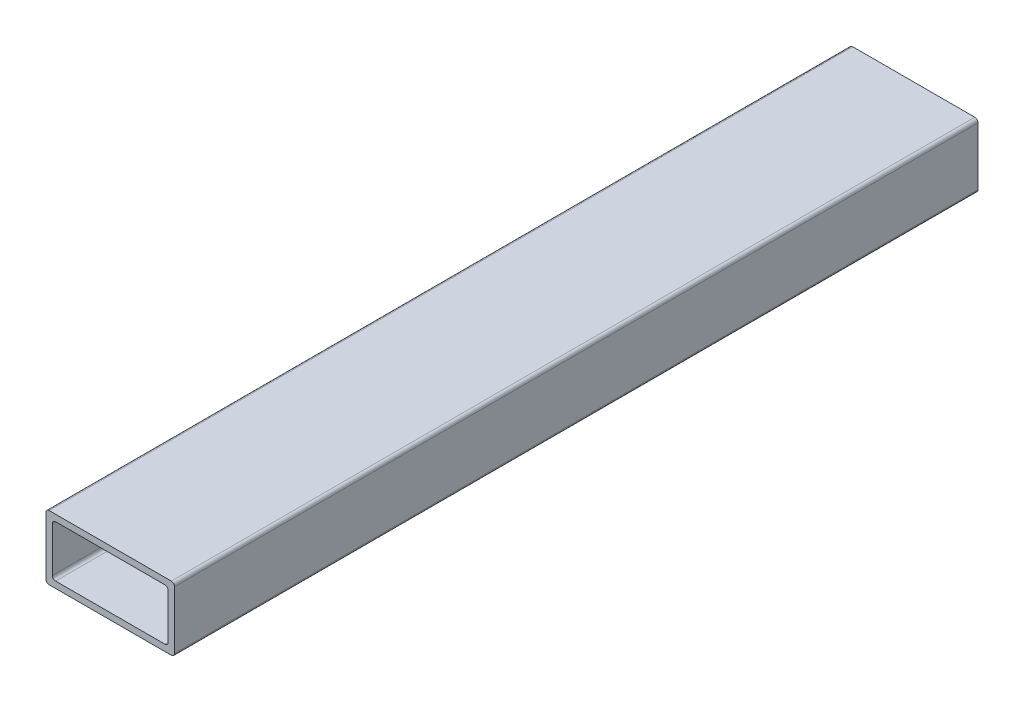
ISO-10303-21;
HEADER;
FILE_DESCRIPTION(('STEP AP214'),'2;1');
FILE_NAME('part.step','',(''),(''),'','','');
FILE_SCHEMA(('AUTOMOTIVE_DESIGN { 1 0 10303 214 1 1 1 1 }'));
ENDSEC;
DATA;
#1=APPLICATION_CONTEXT('core data for automotive mechanical design processes');
#2=APPLICATION_PROTOCOL_DEFINITION('international standard','automotive_design',2000,#1);
#3=PRODUCT_CONTEXT('',#1,'mechanical');
#4=PRODUCT('Part','Part','',(#3));
#5=PRODUCT_RELATED_PRODUCT_CATEGORY('part','',(#4));
#6=PRODUCT_DEFINITION_FORMATION('','',#4);
#7=PRODUCT_DEFINITION_CONTEXT('part definition',#1,'design');
#8=PRODUCT_DEFINITION('design','',#6,#7);
#9=PRODUCT_DEFINITION_SHAPE('','',#8);
#10=(LENGTH_UNIT() NAMED_UNIT(*) SI_UNIT(.MILLI.,.METRE.));
#11=(NAMED_UNIT(*) PLANE_ANGLE_UNIT() SI_UNIT($,.RADIAN.));
#12=(NAMED_UNIT(*) SI_UNIT($,.STERADIAN.) SOLID_ANGLE_UNIT());
#13=UNCERTAINTY_MEASURE_WITH_UNIT(LENGTH_MEASURE(1.E-05),#10,'distance_accuracy_value','');
#14=(GEOMETRIC_REPRESENTATION_CONTEXT(3) GLOBAL_UNCERTAINTY_ASSIGNED_CONTEXT((#13)) GLOBAL_UNIT_ASSIGNED_CONTEXT((#10,
#11,#12)) REPRESENTATION_CONTEXT('',''));
#15=CARTESIAN_POINT('',(0.,0.,0.));
#16=DIRECTION('',(0.,0.,1.));
#17=DIRECTION('',(1.,0.,0.));
#18=AXIS2_PLACEMENT_3D('',#15,#16,#17);
#19=CARTESIAN_POINT('',(2.,2.,500.));
#20=DIRECTION('',(0.,0.,-1.));
#21=DIRECTION('',(-1.,0.,0.));
#22=AXIS2_PLACEMENT_3D('',#19,#20,#21);
#23=PLANE('',#22);
#24=CARTESIAN_POINT('',(2.,2.,500.));
#25=DIRECTION('',(0.,0.,1.));
#26=DIRECTION('',(-1.,0.,0.));
#27=AXIS2_PLACEMENT_3D('',#24,#25,#26);
#28=CIRCLE('',#27,2.);
#29=CARTESIAN_POINT('',(0.,2.00000000000001,500.));
#30=VERTEX_POINT('',#29);
#31=CARTESIAN_POINT('',(2.00000000000001,0.,500.));
#32=VERTEX_POINT('',#31);
#33=EDGE_CURVE('E210',#30,#32,#28,.T.);
#34=ORIENTED_EDGE('',*,*,#33,.T.);
#35=DIRECTION('',(1.,0.,0.));
#36=VECTOR('',#35,1.);
#37=CARTESIAN_POINT('',(2.00000000000001,0.,500.));
#38=LINE('',#37,#36);
#39=CARTESIAN_POINT('',(78.,0.,500.));
#40=VERTEX_POINT('',#39);
#41=EDGE_CURVE('E213',#32,#40,#38,.T.);
#42=ORIENTED_EDGE('',*,*,#41,.T.);
#43=CARTESIAN_POINT('',(78.,2.,500.));
#44=DIRECTION('',(0.,0.,1.));
#45=DIRECTION('',(-1.,0.,0.));
#46=AXIS2_PLACEMENT_3D('',#43,#44,#45);
#47=CIRCLE('',#46,2.);
#48=CARTESIAN_POINT('',(80.,2.,500.));
#49=VERTEX_POINT('',#48);
#50=EDGE_CURVE('E216',#40,#49,#47,.T.);
#51=ORIENTED_EDGE('',*,*,#50,.T.);
#52=DIRECTION('',(0.,1.,0.));
#53=VECTOR('',#52,1.);
#54=CARTESIAN_POINT('',(80.,2.,500.));
#55=LINE('',#54,#53);
#56=CARTESIAN_POINT('',(80.,38.,500.));
#57=VERTEX_POINT('',#56);
#58=EDGE_CURVE('E218',#49,#57,#55,.T.);
#59=ORIENTED_EDGE('',*,*,#58,.T.);
#60=CARTESIAN_POINT('',(78.,38.,500.));
#61=DIRECTION('',(0.,0.,1.));
#62=DIRECTION('',(-1.,0.,0.));
#63=AXIS2_PLACEMENT_3D('',#60,#61,#62);
#64=CIRCLE('',#63,2.);
#65=CARTESIAN_POINT('',(78.,40.,500.));
#66=VERTEX_POINT('',#65);
#67=EDGE_CURVE('E220',#57,#66,#64,.T.);
#68=ORIENTED_EDGE('',*,*,#67,.T.);
#69=DIRECTION('',(-1.,0.,0.));
#70=VECTOR('',#69,1.);
#71=CARTESIAN_POINT('',(2.00000000000001,40.,500.));
#72=LINE('',#71,#70);
#73=CARTESIAN_POINT('',(2.00000000000001,40.,500.));
#74=VERTEX_POINT('',#73);
#75=EDGE_CURVE('E222',#66,#74,#72,.T.);
#76=ORIENTED_EDGE('',*,*,#75,.T.);
#77=CARTESIAN_POINT('',(2.,38.,500.));
#78=DIRECTION('',(0.,0.,1.));
#79=DIRECTION('',(-1.,0.,0.));
#80=AXIS2_PLACEMENT_3D('',#77,#78,#79);
#81=CIRCLE('',#80,2.);
#82=CARTESIAN_POINT('',(0.,38.,500.));
#83=VERTEX_POINT('',#82);
#84=EDGE_CURVE('E224',#74,#83,#81,.T.);
#85=ORIENTED_EDGE('',*,*,#84,.T.);
#86=DIRECTION('',(0.,-1.,0.));
#87=VECTOR('',#86,1.);
#88=CARTESIAN_POINT('',(0.,2.00000000000001,500.));
#89=LINE('',#88,#87);
#90=EDGE_CURVE('E226',#83,#30,#89,.T.);
#91=ORIENTED_EDGE('',*,*,#90,.T.);
#92=EDGE_LOOP('',(#34,#42,#51,#59,#68,#76,#85,#91));
#93=FACE_BOUND('',#92,.T.);
#94=CARTESIAN_POINT('',(74.,6.,500.));
#95=DIRECTION('',(0.,0.,1.));
#96=DIRECTION('',(1.,0.,0.));
#97=AXIS2_PLACEMENT_3D('',#94,#95,#96);
#98=CIRCLE('',#97,2.);
#99=CARTESIAN_POINT('',(74.,4.,500.));
#100=VERTEX_POINT('',#99);
#101=CARTESIAN_POINT('',(76.,6.,500.));
#102=VERTEX_POINT('',#101);
#103=EDGE_CURVE('E145',#100,#102,#98,.T.);
#104=ORIENTED_EDGE('',*,*,#103,.F.);
#105=DIRECTION('',(1.,0.,0.));
#106=VECTOR('',#105,1.);
#107=CARTESIAN_POINT('',(6.00000000000001,4.,500.));
#108=LINE('',#107,#106);
#109=CARTESIAN_POINT('',(6.00000000000001,4.,500.));
#110=VERTEX_POINT('',#109);
#111=EDGE_CURVE('E178',#110,#100,#108,.T.);
#112=ORIENTED_EDGE('',*,*,#111,.F.);
#113=CARTESIAN_POINT('',(6.,6.,500.));
#114=DIRECTION('',(0.,0.,1.));
#115=DIRECTION('',(1.,0.,0.));
#116=AXIS2_PLACEMENT_3D('',#113,#114,#115);
#117=CIRCLE('',#116,2.);
#118=CARTESIAN_POINT('',(4.,6.00000000000001,500.));
#119=VERTEX_POINT('',#118);
#120=EDGE_CURVE('E176',#119,#110,#117,.T.);
#121=ORIENTED_EDGE('',*,*,#120,.F.);
#122=DIRECTION('',(0.,-1.,0.));
#123=VECTOR('',#122,1.);
#124=CARTESIAN_POINT('',(4.,6.00000000000001,500.));
#125=LINE('',#124,#123);
#126=CARTESIAN_POINT('',(4.,34.,500.));
#127=VERTEX_POINT('',#126);
#128=EDGE_CURVE('E174',#127,#119,#125,.T.);
#129=ORIENTED_EDGE('',*,*,#128,.F.);
#130=CARTESIAN_POINT('',(6.,34.,500.));
#131=DIRECTION('',(0.,0.,1.));
#132=DIRECTION('',(1.,0.,0.));
#133=AXIS2_PLACEMENT_3D('',#130,#131,#132);
#134=CIRCLE('',#133,2.);
#135=CARTESIAN_POINT('',(6.00000000000001,36.,500.));
#136=VERTEX_POINT('',#135);
#137=EDGE_CURVE('E172',#136,#127,#134,.T.);
#138=ORIENTED_EDGE('',*,*,#137,.F.);
#139=DIRECTION('',(-1.,0.,0.));
#140=VECTOR('',#139,1.);
#141=CARTESIAN_POINT('',(6.00000000000001,36.,500.));
#142=LINE('',#141,#140);
#143=CARTESIAN_POINT('',(74.,36.,500.));
#144=VERTEX_POINT('',#143);
#145=EDGE_CURVE('E168',#144,#136,#142,.T.);
#146=ORIENTED_EDGE('',*,*,#145,.F.);
#147=CARTESIAN_POINT('',(74.,34.,500.));
#148=DIRECTION('',(0.,0.,1.));
#149=DIRECTION('',(1.,0.,0.));
#150=AXIS2_PLACEMENT_3D('',#147,#148,#149);
#151=CIRCLE('',#150,2.);
#152=CARTESIAN_POINT('',(76.,34.,500.));
#153=VERTEX_POINT('',#152);
#154=EDGE_CURVE('E166',#153,#144,#151,.T.);
#155=ORIENTED_EDGE('',*,*,#154,.F.);
#156=DIRECTION('',(0.,1.,0.));
#157=VECTOR('',#156,1.);
#158=CARTESIAN_POINT('',(76.,6.,500.));
#159=LINE('',#158,#157);
#160=EDGE_CURVE('E153',#102,#153,#159,.T.);
#161=ORIENTED_EDGE('',*,*,#160,.F.);
#162=EDGE_LOOP('',(#104,#112,#121,#129,#138,#146,#155,#161));
#163=FACE_BOUND('',#162,.T.);
#164=ADVANCED_FACE('F32',(#93,#163),#23,.F.);
#165=CARTESIAN_POINT('',(2.,2.,0.));
#166=DIRECTION('',(0.,0.,-1.));
#167=DIRECTION('',(-1.,0.,0.));
#168=AXIS2_PLACEMENT_3D('',#165,#166,#167);
#169=PLANE('',#168);
#170=CARTESIAN_POINT('',(2.,2.,0.));
#171=DIRECTION('',(0.,0.,1.));
#172=DIRECTION('',(-1.,0.,0.));
#173=AXIS2_PLACEMENT_3D('',#170,#171,#172);
#174=CIRCLE('',#173,2.);
#175=CARTESIAN_POINT('',(0.,2.00000000000001,0.));
#176=VERTEX_POINT('',#175);
#177=CARTESIAN_POINT('',(2.00000000000001,0.,0.));
#178=VERTEX_POINT('',#177);
#179=EDGE_CURVE('E161',#176,#178,#174,.T.);
#180=ORIENTED_EDGE('',*,*,#179,.F.);
#181=DIRECTION('',(0.,-1.,0.));
#182=VECTOR('',#181,1.);
#183=CARTESIAN_POINT('',(0.,2.00000000000001,0.));
#184=LINE('',#183,#182);
#185=CARTESIAN_POINT('',(0.,38.,0.));
#186=VERTEX_POINT('',#185);
#187=EDGE_CURVE('E214',#186,#176,#184,.T.);
#188=ORIENTED_EDGE('',*,*,#187,.F.);
#189=CARTESIAN_POINT('',(2.,38.,0.));
#190=DIRECTION('',(0.,0.,1.));
#191=DIRECTION('',(-1.,0.,0.));
#192=AXIS2_PLACEMENT_3D('',#189,#190,#191);
#193=CIRCLE('',#192,2.);
#194=CARTESIAN_POINT('',(2.00000000000001,40.,0.));
#195=VERTEX_POINT('',#194);
#196=EDGE_CURVE('E241',#195,#186,#193,.T.);
#197=ORIENTED_EDGE('',*,*,#196,.F.);
#198=DIRECTION('',(-1.,0.,0.));
#199=VECTOR('',#198,1.);
#200=CARTESIAN_POINT('',(2.00000000000001,40.,0.));
#201=LINE('',#200,#199);
#202=CARTESIAN_POINT('',(78.,40.,0.));
#203=VERTEX_POINT('',#202);
#204=EDGE_CURVE('E239',#203,#195,#201,.T.);
#205=ORIENTED_EDGE('',*,*,#204,.F.);
#206=CARTESIAN_POINT('',(78.,38.,0.));
#207=DIRECTION('',(0.,0.,1.));
#208=DIRECTION('',(-1.,0.,0.));
#209=AXIS2_PLACEMENT_3D('',#206,#207,#208);
#210=CIRCLE('',#209,2.);
#211=CARTESIAN_POINT('',(80.,38.,0.));
#212=VERTEX_POINT('',#211);
#213=EDGE_CURVE('E237',#212,#203,#210,.T.);
#214=ORIENTED_EDGE('',*,*,#213,.F.);
#215=DIRECTION('',(0.,1.,0.));
#216=VECTOR('',#215,1.);
#217=CARTESIAN_POINT('',(80.,2.,0.));
#218=LINE('',#217,#216);
#219=CARTESIAN_POINT('',(80.,2.,0.));
#220=VERTEX_POINT('',#219);
#221=EDGE_CURVE('E235',#220,#212,#218,.T.);
#222=ORIENTED_EDGE('',*,*,#221,.F.);
#223=CARTESIAN_POINT('',(78.,2.,0.));
#224=DIRECTION('',(0.,0.,1.));
#225=DIRECTION('',(-1.,0.,0.));
#226=AXIS2_PLACEMENT_3D('',#223,#224,#225);
#227=CIRCLE('',#226,2.);
#228=CARTESIAN_POINT('',(78.,0.,0.));
#229=VERTEX_POINT('',#228);
#230=EDGE_CURVE('E233',#229,#220,#227,.T.);
#231=ORIENTED_EDGE('',*,*,#230,.F.);
#232=DIRECTION('',(1.,0.,0.));
#233=VECTOR('',#232,1.);
#234=CARTESIAN_POINT('',(2.00000000000001,0.,0.));
#235=LINE('',#234,#233);
#236=EDGE_CURVE('E231',#178,#229,#235,.T.);
#237=ORIENTED_EDGE('',*,*,#236,.F.);
#238=EDGE_LOOP('',(#180,#188,#197,#205,#214,#222,#231,#237));
#239=FACE_BOUND('',#238,.T.);
#240=DIRECTION('',(1.,0.,0.));
#241=VECTOR('',#240,1.);
#242=CARTESIAN_POINT('',(6.00000000000001,4.,0.));
#243=LINE('',#242,#241);
#244=CARTESIAN_POINT('',(6.00000000000001,4.,0.));
#245=VERTEX_POINT('',#244);
#246=CARTESIAN_POINT('',(74.,4.,0.));
#247=VERTEX_POINT('',#246);
#248=EDGE_CURVE('E154',#245,#247,#243,.T.);
#249=ORIENTED_EDGE('',*,*,#248,.T.);
#250=CARTESIAN_POINT('',(74.,6.,0.));
#251=DIRECTION('',(0.,0.,1.));
#252=DIRECTION('',(1.,0.,0.));
#253=AXIS2_PLACEMENT_3D('',#250,#251,#252);
#254=CIRCLE('',#253,2.);
#255=CARTESIAN_POINT('',(76.,6.,0.));
#256=VERTEX_POINT('',#255);
#257=EDGE_CURVE('E55',#247,#256,#254,.T.);
#258=ORIENTED_EDGE('',*,*,#257,.T.);
#259=DIRECTION('',(0.,1.,0.));
#260=VECTOR('',#259,1.);
#261=CARTESIAN_POINT('',(76.,6.,0.));
#262=LINE('',#261,#260);
#263=CARTESIAN_POINT('',(76.,34.,0.));
#264=VERTEX_POINT('',#263);
#265=EDGE_CURVE('E160',#256,#264,#262,.T.);
#266=ORIENTED_EDGE('',*,*,#265,.T.);
#267=CARTESIAN_POINT('',(74.,34.,0.));
#268=DIRECTION('',(0.,0.,1.));
#269=DIRECTION('',(1.,0.,0.));
#270=AXIS2_PLACEMENT_3D('',#267,#268,#269);
#271=CIRCLE('',#270,2.);
#272=CARTESIAN_POINT('',(74.,36.,0.));
#273=VERTEX_POINT('',#272);
#274=EDGE_CURVE('E182',#264,#273,#271,.T.);
#275=ORIENTED_EDGE('',*,*,#274,.T.);
#276=DIRECTION('',(-1.,0.,0.));
#277=VECTOR('',#276,1.);
#278=CARTESIAN_POINT('',(6.00000000000001,36.,0.));
#279=LINE('',#278,#277);
#280=CARTESIAN_POINT('',(6.00000000000001,36.,0.));
#281=VERTEX_POINT('',#280);
#282=EDGE_CURVE('E185',#273,#281,#279,.T.);
#283=ORIENTED_EDGE('',*,*,#282,.T.);
#284=CARTESIAN_POINT('',(6.,34.,0.));
#285=DIRECTION('',(0.,0.,1.));
#286=DIRECTION('',(1.,0.,0.));
#287=AXIS2_PLACEMENT_3D('',#284,#285,#286);
#288=CIRCLE('',#287,2.);
#289=CARTESIAN_POINT('',(4.,34.,0.));
#290=VERTEX_POINT('',#289);
#291=EDGE_CURVE('E188',#281,#290,#288,.T.);
#292=ORIENTED_EDGE('',*,*,#291,.T.);
#293=DIRECTION('',(0.,-1.,0.));
#294=VECTOR('',#293,1.);
#295=CARTESIAN_POINT('',(4.,6.00000000000001,0.));
#296=LINE('',#295,#294);
#297=CARTESIAN_POINT('',(4.,6.00000000000001,0.));
#298=VERTEX_POINT('',#297);
#299=EDGE_CURVE('E191',#290,#298,#296,.T.);
#300=ORIENTED_EDGE('',*,*,#299,.T.);
#301=CARTESIAN_POINT('',(6.,6.,0.));
#302=DIRECTION('',(0.,0.,1.));
#303=DIRECTION('',(1.,0.,0.));
#304=AXIS2_PLACEMENT_3D('',#301,#302,#303);
#305=CIRCLE('',#304,2.);
#306=EDGE_CURVE('E194',#298,#245,#305,.T.);
#307=ORIENTED_EDGE('',*,*,#306,.T.);
#308=EDGE_LOOP('',(#249,#258,#266,#275,#283,#292,#300,#307));
#309=FACE_BOUND('',#308,.T.);
#310=ADVANCED_FACE('F271',(#239,#309),#169,.T.);
#311=CARTESIAN_POINT('',(2.,2.,500.));
#312=DIRECTION('',(0.,0.,-1.));
#313=DIRECTION('',(-1.,0.,0.));
#314=AXIS2_PLACEMENT_3D('',#311,#312,#313);
#315=CYLINDRICAL_SURFACE('',#314,2.);
#316=ORIENTED_EDGE('',*,*,#179,.T.);
#317=DIRECTION('',(0.,0.,-1.));
#318=VECTOR('',#317,1.);
#319=CARTESIAN_POINT('',(2.00000000000001,0.,500.));
#320=LINE('',#319,#318);
#321=EDGE_CURVE('E11',#32,#178,#320,.T.);
#322=ORIENTED_EDGE('',*,*,#321,.F.);
#323=ORIENTED_EDGE('',*,*,#33,.F.);
#324=DIRECTION('',(0.,0.,-1.));
#325=VECTOR('',#324,1.);
#326=CARTESIAN_POINT('',(0.,2.00000000000001,500.));
#327=LINE('',#326,#325);
#328=EDGE_CURVE('E228',#30,#176,#327,.T.);
#329=ORIENTED_EDGE('',*,*,#328,.T.);
#330=EDGE_LOOP('',(#316,#322,#323,#329));
#331=FACE_BOUND('',#330,.T.);
#332=ADVANCED_FACE('F34',(#331),#315,.T.);
#333=CARTESIAN_POINT('',(2.00000000000001,0.,500.));
#334=DIRECTION('',(0.,1.,0.));
#335=DIRECTION('',(0.,0.,1.));
#336=AXIS2_PLACEMENT_3D('',#333,#334,#335);
#337=PLANE('',#336);
#338=ORIENTED_EDGE('',*,*,#236,.T.);
#339=DIRECTION('',(0.,0.,-1.));
#340=VECTOR('',#339,1.);
#341=CARTESIAN_POINT('',(78.,0.,500.));
#342=LINE('',#341,#340);
#343=EDGE_CURVE('E40',#40,#229,#342,.T.);
#344=ORIENTED_EDGE('',*,*,#343,.F.);
#345=ORIENTED_EDGE('',*,*,#41,.F.);
#346=ORIENTED_EDGE('',*,*,#321,.T.);
#347=EDGE_LOOP('',(#338,#344,#345,#346));
#348=FACE_BOUND('',#347,.T.);
#349=ADVANCED_FACE('F288',(#348),#337,.F.);
#350=CARTESIAN_POINT('',(78.,2.,500.));
#351=DIRECTION('',(0.,0.,-1.));
#352=DIRECTION('',(-1.,0.,0.));
#353=AXIS2_PLACEMENT_3D('',#350,#351,#352);
#354=CYLINDRICAL_SURFACE('',#353,2.);
#355=ORIENTED_EDGE('',*,*,#230,.T.);
#356=DIRECTION('',(0.,0.,-1.));
#357=VECTOR('',#356,1.);
#358=CARTESIAN_POINT('',(80.,2.,500.));
#359=LINE('',#358,#357);
#360=EDGE_CURVE('E258',#49,#220,#359,.T.);
#361=ORIENTED_EDGE('',*,*,#360,.F.);
#362=ORIENTED_EDGE('',*,*,#50,.F.);
#363=ORIENTED_EDGE('',*,*,#343,.T.);
#364=EDGE_LOOP('',(#355,#361,#362,#363));
#365=FACE_BOUND('',#364,.T.);
#366=ADVANCED_FACE('F265',(#365),#354,.T.);
#367=CARTESIAN_POINT('',(80.,2.,500.));
#368=DIRECTION('',(-1.,0.,0.));
#369=DIRECTION('',(0.,0.,1.));
#370=AXIS2_PLACEMENT_3D('',#367,#368,#369);
#371=PLANE('',#370);
#372=ORIENTED_EDGE('',*,*,#221,.T.);
#373=DIRECTION('',(0.,0.,-1.));
#374=VECTOR('',#373,1.);
#375=CARTESIAN_POINT('',(80.,38.,500.));
#376=LINE('',#375,#374);
#377=EDGE_CURVE('E255',#57,#212,#376,.T.);
#378=ORIENTED_EDGE('',*,*,#377,.F.);
#379=ORIENTED_EDGE('',*,*,#58,.F.);
#380=ORIENTED_EDGE('',*,*,#360,.T.);
#381=EDGE_LOOP('',(#372,#378,#379,#380));
#382=FACE_BOUND('',#381,.T.);
#383=ADVANCED_FACE('F277',(#382),#371,.F.);
#384=CARTESIAN_POINT('',(78.,38.,500.));
#385=DIRECTION('',(0.,0.,-1.));
#386=DIRECTION('',(-1.,0.,0.));
#387=AXIS2_PLACEMENT_3D('',#384,#385,#386);
#388=CYLINDRICAL_SURFACE('',#387,2.);
#389=ORIENTED_EDGE('',*,*,#213,.T.);
#390=DIRECTION('',(0.,0.,-1.));
#391=VECTOR('',#390,1.);
#392=CARTESIAN_POINT('',(78.,40.,500.));
#393=LINE('',#392,#391);
#394=EDGE_CURVE('E252',#66,#203,#393,.T.);
#395=ORIENTED_EDGE('',*,*,#394,.F.);
#396=ORIENTED_EDGE('',*,*,#67,.F.);
#397=ORIENTED_EDGE('',*,*,#377,.T.);
#398=EDGE_LOOP('',(#389,#395,#396,#397));
#399=FACE_BOUND('',#398,.T.);
#400=ADVANCED_FACE('F281',(#399),#388,.T.);
#401=CARTESIAN_POINT('',(2.00000000000001,40.,500.));
#402=DIRECTION('',(0.,-1.,0.));
#403=DIRECTION('',(0.,0.,-1.));
#404=AXIS2_PLACEMENT_3D('',#401,#402,#403);
#405=PLANE('',#404);
#406=ORIENTED_EDGE('',*,*,#204,.T.);
#407=DIRECTION('',(0.,0.,-1.));
#408=VECTOR('',#407,1.);
#409=CARTESIAN_POINT('',(2.00000000000001,40.,500.));
#410=LINE('',#409,#408);
#411=EDGE_CURVE('E249',#74,#195,#410,.T.);
#412=ORIENTED_EDGE('',*,*,#411,.F.);
#413=ORIENTED_EDGE('',*,*,#75,.F.);
#414=ORIENTED_EDGE('',*,*,#394,.T.);
#415=EDGE_LOOP('',(#406,#412,#413,#414));
#416=FACE_BOUND('',#415,.T.);
#417=ADVANCED_FACE('F301',(#416),#405,.F.);
#418=CARTESIAN_POINT('',(2.,38.,500.));
#419=DIRECTION('',(0.,0.,-1.));
#420=DIRECTION('',(-1.,0.,0.));
#421=AXIS2_PLACEMENT_3D('',#418,#419,#420);
#422=CYLINDRICAL_SURFACE('',#421,2.);
#423=ORIENTED_EDGE('',*,*,#196,.T.);
#424=DIRECTION('',(0.,0.,-1.));
#425=VECTOR('',#424,1.);
#426=CARTESIAN_POINT('',(0.,38.,500.));
#427=LINE('',#426,#425);
#428=EDGE_CURVE('E246',#83,#186,#427,.T.);
#429=ORIENTED_EDGE('',*,*,#428,.F.);
#430=ORIENTED_EDGE('',*,*,#84,.F.);
#431=ORIENTED_EDGE('',*,*,#411,.T.);
#432=EDGE_LOOP('',(#423,#429,#430,#431));
#433=FACE_BOUND('',#432,.T.);
#434=ADVANCED_FACE('F299',(#433),#422,.T.);
#435=CARTESIAN_POINT('',(0.,2.00000000000001,500.));
#436=DIRECTION('',(1.,0.,0.));
#437=DIRECTION('',(0.,0.,-1.));
#438=AXIS2_PLACEMENT_3D('',#435,#436,#437);
#439=PLANE('',#438);
#440=ORIENTED_EDGE('',*,*,#187,.T.);
#441=ORIENTED_EDGE('',*,*,#328,.F.);
#442=ORIENTED_EDGE('',*,*,#90,.F.);
#443=ORIENTED_EDGE('',*,*,#428,.T.);
#444=EDGE_LOOP('',(#440,#441,#442,#443));
#445=FACE_BOUND('',#444,.T.);
#446=ADVANCED_FACE('F294',(#445),#439,.F.);
#447=CARTESIAN_POINT('',(74.,6.,500.));
#448=DIRECTION('',(0.,0.,-1.));
#449=DIRECTION('',(-1.,0.,0.));
#450=AXIS2_PLACEMENT_3D('',#447,#448,#449);
#451=CYLINDRICAL_SURFACE('',#450,2.);
#452=ORIENTED_EDGE('',*,*,#257,.F.);
#453=DIRECTION('',(0.,0.,-1.));
#454=VECTOR('',#453,1.);
#455=CARTESIAN_POINT('',(74.,4.,500.));
#456=LINE('',#455,#454);
#457=EDGE_CURVE('E149',#100,#247,#456,.T.);
#458=ORIENTED_EDGE('',*,*,#457,.F.);
#459=ORIENTED_EDGE('',*,*,#103,.T.);
#460=DIRECTION('',(0.,0.,-1.));
#461=VECTOR('',#460,1.);
#462=CARTESIAN_POINT('',(76.,6.,500.));
#463=LINE('',#462,#461);
#464=EDGE_CURVE('E148',#102,#256,#463,.T.);
#465=ORIENTED_EDGE('',*,*,#464,.T.);
#466=EDGE_LOOP('',(#452,#458,#459,#465));
#467=FACE_BOUND('',#466,.T.);
#468=ADVANCED_FACE('F147',(#467),#451,.F.);
#469=CARTESIAN_POINT('',(76.,6.,500.));
#470=DIRECTION('',(-1.,0.,0.));
#471=DIRECTION('',(0.,0.,1.));
#472=AXIS2_PLACEMENT_3D('',#469,#470,#471);
#473=PLANE('',#472);
#474=ORIENTED_EDGE('',*,*,#265,.F.);
#475=ORIENTED_EDGE('',*,*,#464,.F.);
#476=ORIENTED_EDGE('',*,*,#160,.T.);
#477=DIRECTION('',(0.,0.,-1.));
#478=VECTOR('',#477,1.);
#479=CARTESIAN_POINT('',(76.,34.,500.));
#480=LINE('',#479,#478);
#481=EDGE_CURVE('E162',#153,#264,#480,.T.);
#482=ORIENTED_EDGE('',*,*,#481,.T.);
#483=EDGE_LOOP('',(#474,#475,#476,#482));
#484=FACE_BOUND('',#483,.T.);
#485=ADVANCED_FACE('F157',(#484),#473,.T.);
#486=CARTESIAN_POINT('',(74.,34.,500.));
#487=DIRECTION('',(0.,0.,-1.));
#488=DIRECTION('',(-1.,0.,0.));
#489=AXIS2_PLACEMENT_3D('',#486,#487,#488);
#490=CYLINDRICAL_SURFACE('',#489,2.);
#491=ORIENTED_EDGE('',*,*,#274,.F.);
#492=ORIENTED_EDGE('',*,*,#481,.F.);
#493=ORIENTED_EDGE('',*,*,#154,.T.);
#494=DIRECTION('',(0.,0.,-1.));
#495=VECTOR('',#494,1.);
#496=CARTESIAN_POINT('',(74.,36.,500.));
#497=LINE('',#496,#495);
#498=EDGE_CURVE('E207',#144,#273,#497,.T.);
#499=ORIENTED_EDGE('',*,*,#498,.T.);
#500=EDGE_LOOP('',(#491,#492,#493,#499));
#501=FACE_BOUND('',#500,.T.);
#502=ADVANCED_FACE('F326',(#501),#490,.F.);
#503=CARTESIAN_POINT('',(6.00000000000001,36.,500.));
#504=DIRECTION('',(0.,-1.,0.));
#505=DIRECTION('',(0.,0.,-1.));
#506=AXIS2_PLACEMENT_3D('',#503,#504,#505);
#507=PLANE('',#506);
#508=ORIENTED_EDGE('',*,*,#282,.F.);
#509=ORIENTED_EDGE('',*,*,#498,.F.);
#510=ORIENTED_EDGE('',*,*,#145,.T.);
#511=DIRECTION('',(0.,0.,-1.));
#512=VECTOR('',#511,1.);
#513=CARTESIAN_POINT('',(6.00000000000001,36.,500.));
#514=LINE('',#513,#512);
#515=EDGE_CURVE('E205',#136,#281,#514,.T.);
#516=ORIENTED_EDGE('',*,*,#515,.T.);
#517=EDGE_LOOP('',(#508,#509,#510,#516));
#518=FACE_BOUND('',#517,.T.);
#519=ADVANCED_FACE('F330',(#518),#507,.T.);
#520=CARTESIAN_POINT('',(6.,34.,500.));
#521=DIRECTION('',(0.,0.,-1.));
#522=DIRECTION('',(-1.,0.,0.));
#523=AXIS2_PLACEMENT_3D('',#520,#521,#522);
#524=CYLINDRICAL_SURFACE('',#523,2.);
#525=ORIENTED_EDGE('',*,*,#291,.F.);
#526=ORIENTED_EDGE('',*,*,#515,.F.);
#527=ORIENTED_EDGE('',*,*,#137,.T.);
#528=DIRECTION('',(0.,0.,-1.));
#529=VECTOR('',#528,1.);
#530=CARTESIAN_POINT('',(4.,34.,500.));
#531=LINE('',#530,#529);
#532=EDGE_CURVE('E203',#127,#290,#531,.T.);
#533=ORIENTED_EDGE('',*,*,#532,.T.);
#534=EDGE_LOOP('',(#525,#526,#527,#533));
#535=FACE_BOUND('',#534,.T.);
#536=ADVANCED_FACE('F336',(#535),#524,.F.);
#537=CARTESIAN_POINT('',(4.,6.00000000000001,500.));
#538=DIRECTION('',(1.,0.,0.));
#539=DIRECTION('',(0.,0.,-1.));
#540=AXIS2_PLACEMENT_3D('',#537,#538,#539);
#541=PLANE('',#540);
#542=ORIENTED_EDGE('',*,*,#299,.F.);
#543=ORIENTED_EDGE('',*,*,#532,.F.);
#544=ORIENTED_EDGE('',*,*,#128,.T.);
#545=DIRECTION('',(0.,0.,-1.));
#546=VECTOR('',#545,1.);
#547=CARTESIAN_POINT('',(4.,6.00000000000001,500.));
#548=LINE('',#547,#546);
#549=EDGE_CURVE('E201',#119,#298,#548,.T.);
#550=ORIENTED_EDGE('',*,*,#549,.T.);
#551=EDGE_LOOP('',(#542,#543,#544,#550));
#552=FACE_BOUND('',#551,.T.);
#553=ADVANCED_FACE('F340',(#552),#541,.T.);
#554=CARTESIAN_POINT('',(6.,6.,500.));
#555=DIRECTION('',(0.,0.,-1.));
#556=DIRECTION('',(-1.,0.,0.));
#557=AXIS2_PLACEMENT_3D('',#554,#555,#556);
#558=CYLINDRICAL_SURFACE('',#557,2.);
#559=ORIENTED_EDGE('',*,*,#306,.F.);
#560=ORIENTED_EDGE('',*,*,#549,.F.);
#561=ORIENTED_EDGE('',*,*,#120,.T.);
#562=DIRECTION('',(0.,0.,-1.));
#563=VECTOR('',#562,1.);
#564=CARTESIAN_POINT('',(6.00000000000001,4.,500.));
#565=LINE('',#564,#563);
#566=EDGE_CURVE('E47',#110,#245,#565,.T.);
#567=ORIENTED_EDGE('',*,*,#566,.T.);
#568=EDGE_LOOP('',(#559,#560,#561,#567));
#569=FACE_BOUND('',#568,.T.);
#570=ADVANCED_FACE('F344',(#569),#558,.F.);
#571=CARTESIAN_POINT('',(6.00000000000001,4.,500.));
#572=DIRECTION('',(0.,1.,0.));
#573=DIRECTION('',(0.,0.,1.));
#574=AXIS2_PLACEMENT_3D('',#571,#572,#573);
#575=PLANE('',#574);
#576=ORIENTED_EDGE('',*,*,#248,.F.);
#577=ORIENTED_EDGE('',*,*,#566,.F.);
#578=ORIENTED_EDGE('',*,*,#111,.T.);
#579=ORIENTED_EDGE('',*,*,#457,.T.);
#580=EDGE_LOOP('',(#576,#577,#578,#579));
#581=FACE_BOUND('',#580,.T.);
#582=ADVANCED_FACE('F348',(#581),#575,.T.);
#583=CLOSED_SHELL('',(#164,#310,#332,#349,#366,#383,#400,#417,#434,#446,#468,#485,#502,#519,
#536,#553,#570,#582));
#584=MANIFOLD_SOLID_BREP('B2',#583);
#585=ADVANCED_BREP_SHAPE_REPRESENTATION('',(#18,#584),#14);
#586=SHAPE_DEFINITION_REPRESENTATION(#9,#585);
ENDSEC;
END-ISO-10303-21;
